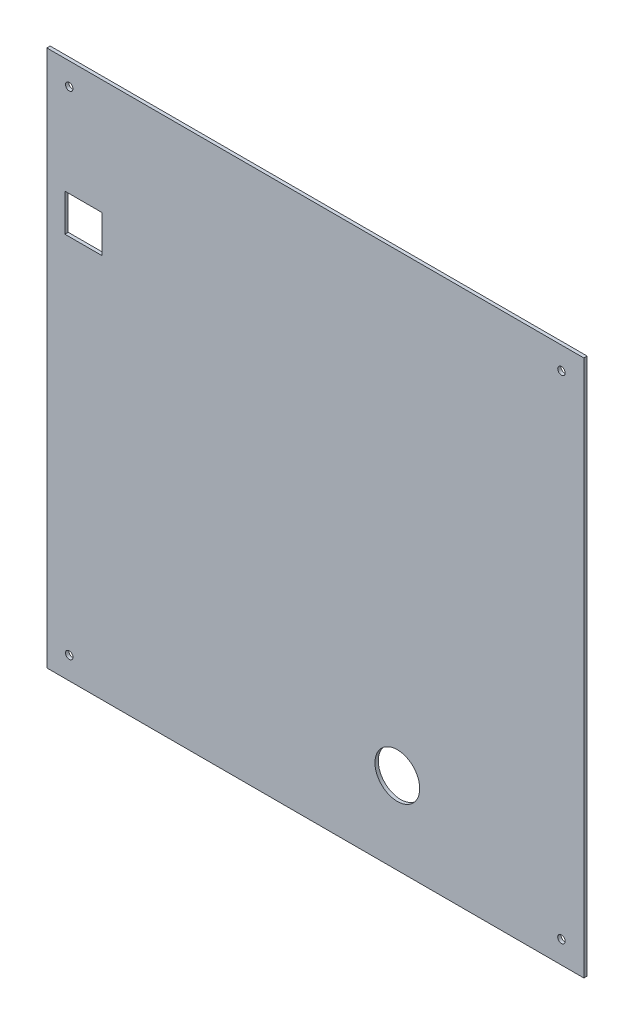
ISO-10303-21;
HEADER;
FILE_DESCRIPTION(('STEP AP214'),'2;1');
FILE_NAME('part.step','',(''),(''),'','','');
FILE_SCHEMA(('AUTOMOTIVE_DESIGN { 1 0 10303 214 1 1 1 1 }'));
ENDSEC;
DATA;
#1=APPLICATION_CONTEXT('core data for automotive mechanical design processes');
#2=APPLICATION_PROTOCOL_DEFINITION('international standard','automotive_design',2000,#1);
#3=PRODUCT_CONTEXT('',#1,'mechanical');
#4=PRODUCT('Part','Part','',(#3));
#5=PRODUCT_RELATED_PRODUCT_CATEGORY('part','',(#4));
#6=PRODUCT_DEFINITION_FORMATION('','',#4);
#7=PRODUCT_DEFINITION_CONTEXT('part definition',#1,'design');
#8=PRODUCT_DEFINITION('design','',#6,#7);
#9=PRODUCT_DEFINITION_SHAPE('','',#8);
#10=(LENGTH_UNIT() NAMED_UNIT(*) SI_UNIT(.MILLI.,.METRE.));
#11=(NAMED_UNIT(*) PLANE_ANGLE_UNIT() SI_UNIT($,.RADIAN.));
#12=(NAMED_UNIT(*) SI_UNIT($,.STERADIAN.) SOLID_ANGLE_UNIT());
#13=UNCERTAINTY_MEASURE_WITH_UNIT(LENGTH_MEASURE(1.E-05),#10,'distance_accuracy_value','');
#14=(GEOMETRIC_REPRESENTATION_CONTEXT(3) GLOBAL_UNCERTAINTY_ASSIGNED_CONTEXT((#13)) GLOBAL_UNIT_ASSIGNED_CONTEXT((#10,
#11,#12)) REPRESENTATION_CONTEXT('',''));
#15=CARTESIAN_POINT('',(0.,0.,0.));
#16=DIRECTION('',(0.,0.,1.));
#17=DIRECTION('',(1.,0.,0.));
#18=AXIS2_PLACEMENT_3D('',#15,#16,#17);
#19=CARTESIAN_POINT('',(-279.4,0.19050000000001,2.8321));
#20=DIRECTION('',(1.,0.,0.));
#21=DIRECTION('',(0.,1.,0.));
#22=AXIS2_PLACEMENT_3D('',#19,#20,#21);
#23=PLANE('',#22);
#24=DIRECTION('',(0.,-1.,0.));
#25=VECTOR('',#24,1.);
#26=CARTESIAN_POINT('',(-279.4,0.19050000000001,0.));
#27=LINE('',#26,#25);
#28=CARTESIAN_POINT('',(-279.4,0.19050000000001,0.));
#29=VERTEX_POINT('',#28);
#30=CARTESIAN_POINT('',(-279.4,-457.0095,0.));
#31=VERTEX_POINT('',#30);
#32=EDGE_CURVE('E140',#29,#31,#27,.T.);
#33=ORIENTED_EDGE('',*,*,#32,.T.);
#34=DIRECTION('',(0.,0.,-1.));
#35=VECTOR('',#34,1.);
#36=CARTESIAN_POINT('',(-279.4,-457.0095,2.8321));
#37=LINE('',#36,#35);
#38=CARTESIAN_POINT('',(-279.4,-457.0095,2.8321));
#39=VERTEX_POINT('',#38);
#40=EDGE_CURVE('E11',#39,#31,#37,.T.);
#41=ORIENTED_EDGE('',*,*,#40,.F.);
#42=DIRECTION('',(0.,-1.,0.));
#43=VECTOR('',#42,1.);
#44=CARTESIAN_POINT('',(-279.4,0.19050000000001,2.8321));
#45=LINE('',#44,#43);
#46=CARTESIAN_POINT('',(-279.4,0.19050000000001,2.8321));
#47=VERTEX_POINT('',#46);
#48=EDGE_CURVE('E145',#47,#39,#45,.T.);
#49=ORIENTED_EDGE('',*,*,#48,.F.);
#50=DIRECTION('',(0.,0.,-1.));
#51=VECTOR('',#50,1.);
#52=CARTESIAN_POINT('',(-279.4,0.19050000000001,2.8321));
#53=LINE('',#52,#51);
#54=EDGE_CURVE('E155',#47,#29,#53,.T.);
#55=ORIENTED_EDGE('',*,*,#54,.T.);
#56=EDGE_LOOP('',(#33,#41,#49,#55));
#57=FACE_BOUND('',#56,.T.);
#58=ADVANCED_FACE('F33',(#57),#23,.F.);
#59=CARTESIAN_POINT('',(-279.4,-457.0095,2.8321));
#60=DIRECTION('',(0.,1.,0.));
#61=DIRECTION('',(0.,0.,1.));
#62=AXIS2_PLACEMENT_3D('',#59,#60,#61);
#63=PLANE('',#62);
#64=DIRECTION('',(1.,0.,0.));
#65=VECTOR('',#64,1.);
#66=CARTESIAN_POINT('',(-279.4,-457.0095,0.));
#67=LINE('',#66,#65);
#68=CARTESIAN_POINT('',(177.8,-457.0095,0.));
#69=VERTEX_POINT('',#68);
#70=EDGE_CURVE('E158',#31,#69,#67,.T.);
#71=ORIENTED_EDGE('',*,*,#70,.T.);
#72=DIRECTION('',(0.,0.,-1.));
#73=VECTOR('',#72,1.);
#74=CARTESIAN_POINT('',(177.8,-457.0095,2.8321));
#75=LINE('',#74,#73);
#76=CARTESIAN_POINT('',(177.8,-457.0095,2.8321));
#77=VERTEX_POINT('',#76);
#78=EDGE_CURVE('E40',#77,#69,#75,.T.);
#79=ORIENTED_EDGE('',*,*,#78,.F.);
#80=DIRECTION('',(1.,0.,0.));
#81=VECTOR('',#80,1.);
#82=CARTESIAN_POINT('',(-279.4,-457.0095,2.8321));
#83=LINE('',#82,#81);
#84=EDGE_CURVE('E148',#39,#77,#83,.T.);
#85=ORIENTED_EDGE('',*,*,#84,.F.);
#86=ORIENTED_EDGE('',*,*,#40,.T.);
#87=EDGE_LOOP('',(#71,#79,#85,#86));
#88=FACE_BOUND('',#87,.T.);
#89=ADVANCED_FACE('F187',(#88),#63,.F.);
#90=CARTESIAN_POINT('',(177.8,0.19050000000001,2.8321));
#91=DIRECTION('',(-1.,0.,0.));
#92=DIRECTION('',(0.,-1.,0.));
#93=AXIS2_PLACEMENT_3D('',#90,#91,#92);
#94=PLANE('',#93);
#95=DIRECTION('',(0.,1.,0.));
#96=VECTOR('',#95,1.);
#97=CARTESIAN_POINT('',(177.8,0.19050000000001,0.));
#98=LINE('',#97,#96);
#99=CARTESIAN_POINT('',(177.8,0.19050000000001,0.));
#100=VERTEX_POINT('',#99);
#101=EDGE_CURVE('E160',#69,#100,#98,.T.);
#102=ORIENTED_EDGE('',*,*,#101,.T.);
#103=DIRECTION('',(0.,0.,-1.));
#104=VECTOR('',#103,1.);
#105=CARTESIAN_POINT('',(177.8,0.19050000000001,2.8321));
#106=LINE('',#105,#104);
#107=CARTESIAN_POINT('',(177.8,0.19050000000001,2.8321));
#108=VERTEX_POINT('',#107);
#109=EDGE_CURVE('E165',#108,#100,#106,.T.);
#110=ORIENTED_EDGE('',*,*,#109,.F.);
#111=DIRECTION('',(0.,1.,0.));
#112=VECTOR('',#111,1.);
#113=CARTESIAN_POINT('',(177.8,0.19050000000001,2.8321));
#114=LINE('',#113,#112);
#115=EDGE_CURVE('E151',#77,#108,#114,.T.);
#116=ORIENTED_EDGE('',*,*,#115,.F.);
#117=ORIENTED_EDGE('',*,*,#78,.T.);
#118=EDGE_LOOP('',(#102,#110,#116,#117));
#119=FACE_BOUND('',#118,.T.);
#120=ADVANCED_FACE('F172',(#119),#94,.F.);
#121=CARTESIAN_POINT('',(-279.4,0.19050000000001,2.8321));
#122=DIRECTION('',(0.,-1.,0.));
#123=DIRECTION('',(0.,0.,-1.));
#124=AXIS2_PLACEMENT_3D('',#121,#122,#123);
#125=PLANE('',#124);
#126=DIRECTION('',(-1.,0.,0.));
#127=VECTOR('',#126,1.);
#128=CARTESIAN_POINT('',(-279.4,0.19050000000001,0.));
#129=LINE('',#128,#127);
#130=EDGE_CURVE('E149',#100,#29,#129,.T.);
#131=ORIENTED_EDGE('',*,*,#130,.T.);
#132=ORIENTED_EDGE('',*,*,#54,.F.);
#133=DIRECTION('',(-1.,0.,0.));
#134=VECTOR('',#133,1.);
#135=CARTESIAN_POINT('',(-279.4,0.19050000000001,2.8321));
#136=LINE('',#135,#134);
#137=EDGE_CURVE('E153',#108,#47,#136,.T.);
#138=ORIENTED_EDGE('',*,*,#137,.F.);
#139=ORIENTED_EDGE('',*,*,#109,.T.);
#140=EDGE_LOOP('',(#131,#132,#138,#139));
#141=FACE_BOUND('',#140,.T.);
#142=ADVANCED_FACE('F180',(#141),#125,.F.);
#143=CARTESIAN_POINT('',(0.,0.,2.8321));
#144=DIRECTION('',(0.,0.,1.));
#145=DIRECTION('',(1.,0.,0.));
#146=AXIS2_PLACEMENT_3D('',#143,#144,#145);
#147=PLANE('',#146);
#148=CARTESIAN_POINT('',(-260.35,-437.9595,2.8321));
#149=DIRECTION('',(0.,0.,1.));
#150=DIRECTION('',(1.,0.,0.));
#151=AXIS2_PLACEMENT_3D('',#148,#149,#150);
#152=CIRCLE('',#151,3.17499999999997);
#153=CARTESIAN_POINT('',(-257.175,-437.9595,2.8321));
#154=VERTEX_POINT('',#153);
#155=EDGE_CURVE('E247',#154,#154,#152,.T.);
#156=ORIENTED_EDGE('',*,*,#155,.F.);
#157=EDGE_LOOP('',(#156));
#158=FACE_BOUND('',#157,.T.);
#159=CARTESIAN_POINT('',(158.75,-437.9595,2.8321));
#160=DIRECTION('',(0.,0.,1.));
#161=DIRECTION('',(1.,0.,0.));
#162=AXIS2_PLACEMENT_3D('',#159,#160,#161);
#163=CIRCLE('',#162,3.17499999999997);
#164=CARTESIAN_POINT('',(161.925,-437.9595,2.8321));
#165=VERTEX_POINT('',#164);
#166=EDGE_CURVE('E253',#165,#165,#163,.T.);
#167=ORIENTED_EDGE('',*,*,#166,.F.);
#168=EDGE_LOOP('',(#167));
#169=FACE_BOUND('',#168,.T.);
#170=CARTESIAN_POINT('',(158.75,-18.8595,2.8321));
#171=DIRECTION('',(0.,0.,1.));
#172=DIRECTION('',(1.,0.,0.));
#173=AXIS2_PLACEMENT_3D('',#170,#171,#172);
#174=CIRCLE('',#173,3.175);
#175=CARTESIAN_POINT('',(161.925,-18.8595,2.8321));
#176=VERTEX_POINT('',#175);
#177=EDGE_CURVE('E121',#176,#176,#174,.T.);
#178=ORIENTED_EDGE('',*,*,#177,.F.);
#179=EDGE_LOOP('',(#178));
#180=FACE_BOUND('',#179,.T.);
#181=DIRECTION('',(0.,1.,0.));
#182=VECTOR('',#181,1.);
#183=CARTESIAN_POINT('',(-232.283,-97.7265,2.8321));
#184=LINE('',#183,#182);
#185=CARTESIAN_POINT('',(-232.283,-129.4765,2.8321));
#186=VERTEX_POINT('',#185);
#187=CARTESIAN_POINT('',(-232.283,-97.7265,2.8321));
#188=VERTEX_POINT('',#187);
#189=EDGE_CURVE('E47',#186,#188,#184,.T.);
#190=ORIENTED_EDGE('',*,*,#189,.F.);
#191=DIRECTION('',(1.,0.,0.));
#192=VECTOR('',#191,1.);
#193=CARTESIAN_POINT('',(-232.283,-129.4765,2.8321));
#194=LINE('',#193,#192);
#195=CARTESIAN_POINT('',(-264.033,-129.4765,2.8321));
#196=VERTEX_POINT('',#195);
#197=EDGE_CURVE('E115',#196,#186,#194,.T.);
#198=ORIENTED_EDGE('',*,*,#197,.F.);
#199=DIRECTION('',(0.,-1.,0.));
#200=VECTOR('',#199,1.);
#201=CARTESIAN_POINT('',(-264.033,-97.7265,2.8321));
#202=LINE('',#201,#200);
#203=CARTESIAN_POINT('',(-264.033,-97.7265,2.8321));
#204=VERTEX_POINT('',#203);
#205=EDGE_CURVE('E118',#204,#196,#202,.T.);
#206=ORIENTED_EDGE('',*,*,#205,.F.);
#207=DIRECTION('',(-1.,0.,0.));
#208=VECTOR('',#207,1.);
#209=CARTESIAN_POINT('',(-232.283,-97.7265,2.8321));
#210=LINE('',#209,#208);
#211=EDGE_CURVE('E127',#188,#204,#210,.T.);
#212=ORIENTED_EDGE('',*,*,#211,.F.);
#213=EDGE_LOOP('',(#190,#198,#206,#212));
#214=FACE_BOUND('',#213,.T.);
#215=CARTESIAN_POINT('',(19.0055500000109,-387.1595,2.8321));
#216=DIRECTION('',(0.,0.,1.));
#217=DIRECTION('',(1.,0.,0.));
#218=AXIS2_PLACEMENT_3D('',#215,#216,#217);
#219=CIRCLE('',#218,19.05);
#220=CARTESIAN_POINT('',(38.0555500000109,-387.1595,2.8321));
#221=VERTEX_POINT('',#220);
#222=EDGE_CURVE('E240',#221,#221,#219,.T.);
#223=ORIENTED_EDGE('',*,*,#222,.F.);
#224=EDGE_LOOP('',(#223));
#225=FACE_BOUND('',#224,.T.);
#226=CARTESIAN_POINT('',(-260.35,-18.8595,2.8321));
#227=DIRECTION('',(0.,0.,1.));
#228=DIRECTION('',(1.,0.,0.));
#229=AXIS2_PLACEMENT_3D('',#226,#227,#228);
#230=CIRCLE('',#229,3.17499999999997);
#231=CARTESIAN_POINT('',(-257.175,-18.8595,2.8321));
#232=VERTEX_POINT('',#231);
#233=EDGE_CURVE('E141',#232,#232,#230,.T.);
#234=ORIENTED_EDGE('',*,*,#233,.F.);
#235=EDGE_LOOP('',(#234));
#236=FACE_BOUND('',#235,.T.);
#237=ORIENTED_EDGE('',*,*,#48,.T.);
#238=ORIENTED_EDGE('',*,*,#84,.T.);
#239=ORIENTED_EDGE('',*,*,#115,.T.);
#240=ORIENTED_EDGE('',*,*,#137,.T.);
#241=EDGE_LOOP('',(#237,#238,#239,#240));
#242=FACE_BOUND('',#241,.T.);
#243=ADVANCED_FACE('F186',(#158,#169,#180,#214,#225,#236,#242),#147,.T.);
#244=CARTESIAN_POINT('',(0.,0.,0.));
#245=DIRECTION('',(0.,0.,1.));
#246=DIRECTION('',(1.,0.,0.));
#247=AXIS2_PLACEMENT_3D('',#244,#245,#246);
#248=PLANE('',#247);
#249=CARTESIAN_POINT('',(-260.35,-437.9595,0.));
#250=DIRECTION('',(0.,0.,1.));
#251=DIRECTION('',(1.,0.,0.));
#252=AXIS2_PLACEMENT_3D('',#249,#250,#251);
#253=CIRCLE('',#252,3.17499999999997);
#254=CARTESIAN_POINT('',(-257.175,-437.9595,0.));
#255=VERTEX_POINT('',#254);
#256=EDGE_CURVE('E144',#255,#255,#253,.T.);
#257=ORIENTED_EDGE('',*,*,#256,.T.);
#258=EDGE_LOOP('',(#257));
#259=FACE_BOUND('',#258,.T.);
#260=CARTESIAN_POINT('',(158.75,-437.9595,0.));
#261=DIRECTION('',(0.,0.,1.));
#262=DIRECTION('',(1.,0.,0.));
#263=AXIS2_PLACEMENT_3D('',#260,#261,#262);
#264=CIRCLE('',#263,3.17499999999997);
#265=CARTESIAN_POINT('',(161.925,-437.9595,0.));
#266=VERTEX_POINT('',#265);
#267=EDGE_CURVE('E250',#266,#266,#264,.T.);
#268=ORIENTED_EDGE('',*,*,#267,.T.);
#269=EDGE_LOOP('',(#268));
#270=FACE_BOUND('',#269,.T.);
#271=CARTESIAN_POINT('',(158.75,-18.8595,0.));
#272=DIRECTION('',(0.,0.,1.));
#273=DIRECTION('',(1.,0.,0.));
#274=AXIS2_PLACEMENT_3D('',#271,#272,#273);
#275=CIRCLE('',#274,3.175);
#276=CARTESIAN_POINT('',(161.925,-18.8595,0.));
#277=VERTEX_POINT('',#276);
#278=EDGE_CURVE('E255',#277,#277,#275,.T.);
#279=ORIENTED_EDGE('',*,*,#278,.T.);
#280=EDGE_LOOP('',(#279));
#281=FACE_BOUND('',#280,.T.);
#282=DIRECTION('',(1.,0.,0.));
#283=VECTOR('',#282,1.);
#284=CARTESIAN_POINT('',(-232.283,-129.4765,0.));
#285=LINE('',#284,#283);
#286=CARTESIAN_POINT('',(-264.033,-129.4765,0.));
#287=VERTEX_POINT('',#286);
#288=CARTESIAN_POINT('',(-232.283,-129.4765,0.));
#289=VERTEX_POINT('',#288);
#290=EDGE_CURVE('E105',#287,#289,#285,.T.);
#291=ORIENTED_EDGE('',*,*,#290,.T.);
#292=DIRECTION('',(0.,1.,0.));
#293=VECTOR('',#292,1.);
#294=CARTESIAN_POINT('',(-232.283,-97.7265,0.));
#295=LINE('',#294,#293);
#296=CARTESIAN_POINT('',(-232.283,-97.7265,0.));
#297=VERTEX_POINT('',#296);
#298=EDGE_CURVE('E99',#289,#297,#295,.T.);
#299=ORIENTED_EDGE('',*,*,#298,.T.);
#300=DIRECTION('',(-1.,0.,0.));
#301=VECTOR('',#300,1.);
#302=CARTESIAN_POINT('',(-232.283,-97.7265,0.));
#303=LINE('',#302,#301);
#304=CARTESIAN_POINT('',(-264.033,-97.7265,0.));
#305=VERTEX_POINT('',#304);
#306=EDGE_CURVE('E108',#297,#305,#303,.T.);
#307=ORIENTED_EDGE('',*,*,#306,.T.);
#308=DIRECTION('',(0.,-1.,0.));
#309=VECTOR('',#308,1.);
#310=CARTESIAN_POINT('',(-264.033,-97.7265,0.));
#311=LINE('',#310,#309);
#312=EDGE_CURVE('E55',#305,#287,#311,.T.);
#313=ORIENTED_EDGE('',*,*,#312,.T.);
#314=EDGE_LOOP('',(#291,#299,#307,#313));
#315=FACE_BOUND('',#314,.T.);
#316=CARTESIAN_POINT('',(19.0055500000109,-387.1595,0.));
#317=DIRECTION('',(0.,0.,1.));
#318=DIRECTION('',(1.,0.,0.));
#319=AXIS2_PLACEMENT_3D('',#316,#317,#318);
#320=CIRCLE('',#319,19.05);
#321=CARTESIAN_POINT('',(38.0555500000109,-387.1595,0.));
#322=VERTEX_POINT('',#321);
#323=EDGE_CURVE('E128',#322,#322,#320,.T.);
#324=ORIENTED_EDGE('',*,*,#323,.T.);
#325=EDGE_LOOP('',(#324));
#326=FACE_BOUND('',#325,.T.);
#327=CARTESIAN_POINT('',(-260.35,-18.8595,0.));
#328=DIRECTION('',(0.,0.,1.));
#329=DIRECTION('',(1.,0.,0.));
#330=AXIS2_PLACEMENT_3D('',#327,#328,#329);
#331=CIRCLE('',#330,3.17499999999997);
#332=CARTESIAN_POINT('',(-257.175,-18.8595,0.));
#333=VERTEX_POINT('',#332);
#334=EDGE_CURVE('E137',#333,#333,#331,.T.);
#335=ORIENTED_EDGE('',*,*,#334,.T.);
#336=EDGE_LOOP('',(#335));
#337=FACE_BOUND('',#336,.T.);
#338=ORIENTED_EDGE('',*,*,#32,.F.);
#339=ORIENTED_EDGE('',*,*,#130,.F.);
#340=ORIENTED_EDGE('',*,*,#101,.F.);
#341=ORIENTED_EDGE('',*,*,#70,.F.);
#342=EDGE_LOOP('',(#338,#339,#340,#341));
#343=FACE_BOUND('',#342,.T.);
#344=ADVANCED_FACE('F112',(#259,#270,#281,#315,#326,#337,#343),#248,.F.);
#345=CARTESIAN_POINT('',(-260.35,-18.8595,0.));
#346=DIRECTION('',(0.,0.,1.));
#347=DIRECTION('',(1.,0.,0.));
#348=AXIS2_PLACEMENT_3D('',#345,#346,#347);
#349=CYLINDRICAL_SURFACE('',#348,3.17499999999997);
#350=CARTESIAN_POINT('',(-257.175,-18.8595,0.));
#351=CARTESIAN_POINT('',(-257.175,-18.8595,0.0295010416666667));
#352=CARTESIAN_POINT('',(-257.175,-18.8595,0.0590020833333333));
#353=CARTESIAN_POINT('',(-257.175,-18.8595,0.118004166666667));
#354=CARTESIAN_POINT('',(-257.175,-18.8595,0.147505208333333));
#355=CARTESIAN_POINT('',(-257.175,-18.8595,0.206507291666667));
#356=CARTESIAN_POINT('',(-257.175,-18.8595,0.236008333333333));
#357=CARTESIAN_POINT('',(-257.175,-18.8595,0.295010416666667));
#358=CARTESIAN_POINT('',(-257.175,-18.8595,0.324511458333333));
#359=CARTESIAN_POINT('',(-257.175,-18.8595,0.383513541666667));
#360=CARTESIAN_POINT('',(-257.175,-18.8595,0.413014583333333));
#361=CARTESIAN_POINT('',(-257.175,-18.8595,0.472016666666667));
#362=CARTESIAN_POINT('',(-257.175,-18.8595,0.501517708333333));
#363=CARTESIAN_POINT('',(-257.175,-18.8595,0.560519791666667));
#364=CARTESIAN_POINT('',(-257.175,-18.8595,0.590020833333333));
#365=CARTESIAN_POINT('',(-257.175,-18.8595,0.649022916666667));
#366=CARTESIAN_POINT('',(-257.175,-18.8595,0.678523958333333));
#367=CARTESIAN_POINT('',(-257.175,-18.8595,0.737526041666667));
#368=CARTESIAN_POINT('',(-257.175,-18.8595,0.767027083333333));
#369=CARTESIAN_POINT('',(-257.175,-18.8595,0.826029166666667));
#370=CARTESIAN_POINT('',(-257.175,-18.8595,0.855530208333333));
#371=CARTESIAN_POINT('',(-257.175,-18.8595,0.914532291666667));
#372=CARTESIAN_POINT('',(-257.175,-18.8595,0.944033333333333));
#373=CARTESIAN_POINT('',(-257.175,-18.8595,1.00303541666667));
#374=CARTESIAN_POINT('',(-257.175,-18.8595,1.03253645833333));
#375=CARTESIAN_POINT('',(-257.175,-18.8595,1.09153854166667));
#376=CARTESIAN_POINT('',(-257.175,-18.8595,1.12103958333333));
#377=CARTESIAN_POINT('',(-257.175,-18.8595,1.18004166666667));
#378=CARTESIAN_POINT('',(-257.175,-18.8595,1.20954270833333));
#379=CARTESIAN_POINT('',(-257.175,-18.8595,1.26854479166667));
#380=CARTESIAN_POINT('',(-257.175,-18.8595,1.29804583333333));
#381=CARTESIAN_POINT('',(-257.175,-18.8595,1.35704791666667));
#382=CARTESIAN_POINT('',(-257.175,-18.8595,1.38654895833333));
#383=CARTESIAN_POINT('',(-257.175,-18.8595,1.44555104166667));
#384=CARTESIAN_POINT('',(-257.175,-18.8595,1.47505208333333));
#385=CARTESIAN_POINT('',(-257.175,-18.8595,1.53405416666667));
#386=CARTESIAN_POINT('',(-257.175,-18.8595,1.56355520833333));
#387=CARTESIAN_POINT('',(-257.175,-18.8595,1.62255729166667));
#388=CARTESIAN_POINT('',(-257.175,-18.8595,1.65205833333333));
#389=CARTESIAN_POINT('',(-257.175,-18.8595,1.71106041666667));
#390=CARTESIAN_POINT('',(-257.175,-18.8595,1.74056145833333));
#391=CARTESIAN_POINT('',(-257.175,-18.8595,1.79956354166667));
#392=CARTESIAN_POINT('',(-257.175,-18.8595,1.82906458333333));
#393=CARTESIAN_POINT('',(-257.175,-18.8595,1.88806666666667));
#394=CARTESIAN_POINT('',(-257.175,-18.8595,1.91756770833333));
#395=CARTESIAN_POINT('',(-257.175,-18.8595,1.97656979166667));
#396=CARTESIAN_POINT('',(-257.175,-18.8595,2.00607083333333));
#397=CARTESIAN_POINT('',(-257.175,-18.8595,2.06507291666667));
#398=CARTESIAN_POINT('',(-257.175,-18.8595,2.09457395833333));
#399=CARTESIAN_POINT('',(-257.175,-18.8595,2.15357604166667));
#400=CARTESIAN_POINT('',(-257.175,-18.8595,2.18307708333333));
#401=CARTESIAN_POINT('',(-257.175,-18.8595,2.24207916666667));
#402=CARTESIAN_POINT('',(-257.175,-18.8595,2.27158020833333));
#403=CARTESIAN_POINT('',(-257.175,-18.8595,2.33058229166667));
#404=CARTESIAN_POINT('',(-257.175,-18.8595,2.36008333333333));
#405=CARTESIAN_POINT('',(-257.175,-18.8595,2.41908541666667));
#406=CARTESIAN_POINT('',(-257.175,-18.8595,2.44858645833333));
#407=CARTESIAN_POINT('',(-257.175,-18.8595,2.50758854166667));
#408=CARTESIAN_POINT('',(-257.175,-18.8595,2.53708958333333));
#409=CARTESIAN_POINT('',(-257.175,-18.8595,2.59609166666667));
#410=CARTESIAN_POINT('',(-257.175,-18.8595,2.62559270833333));
#411=CARTESIAN_POINT('',(-257.175,-18.8595,2.68459479166667));
#412=CARTESIAN_POINT('',(-257.175,-18.8595,2.71409583333333));
#413=CARTESIAN_POINT('',(-257.175,-18.8595,2.77309791666667));
#414=CARTESIAN_POINT('',(-257.175,-18.8595,2.80259895833333));
#415=CARTESIAN_POINT('',(-257.175,-18.8595,2.8321));
#416=B_SPLINE_CURVE_WITH_KNOTS('',3,(#350,#351,#352,#353,#354,#355,#356,#357,#358,#359,#360,
#361,#362,#363,#364,#365,#366,#367,#368,#369,#370,#371,#372,#373,#374,#375,#376,#377,#378,#379,
#380,#381,#382,#383,#384,#385,#386,#387,#388,#389,#390,#391,#392,#393,#394,#395,#396,#397,#398,
#399,#400,#401,#402,#403,#404,#405,#406,#407,#408,#409,#410,#411,#412,#413,#414,#415),
.UNSPECIFIED.,.F.,.F.,(4,2,2,2,2,2,2,2,2,2,2,2,2,2,2,2,2,2,2,2,2,2,2,2,2,2,2,2,2,2,2,2,4),(0.,
0.088503125,0.17700625,0.265509375,0.3540125,0.442515625,0.53101875,0.619521875,0.708025,
0.796528125,0.88503125,0.973534375,1.0620375,1.150540625,1.23904375,1.327546875,1.41605,
1.504553125,1.59305625,1.681559375,1.7700625,1.858565625,1.94706875,2.035571875,2.124075,
2.212578125,2.30108125,2.389584375,2.4780875,2.566590625,2.65509375,2.743596875,2.8321),.UNSPECIFIED.);
#417=EDGE_CURVE('BSEAM199',#333,#232,#416,.T.);
#418=ORIENTED_EDGE('',*,*,#334,.F.);
#419=ORIENTED_EDGE('',*,*,#233,.T.);
#420=ORIENTED_EDGE('',*,*,#417,.T.);
#421=ORIENTED_EDGE('',*,*,#417,.F.);
#422=EDGE_LOOP('',(#418,#420,#419,#421));
#423=FACE_BOUND('',#422,.T.);
#424=ADVANCED_FACE('F199',(#423),#349,.F.);
#425=CARTESIAN_POINT('',(19.0055500000109,-387.1595,0.));
#426=DIRECTION('',(0.,0.,1.));
#427=DIRECTION('',(1.,0.,0.));
#428=AXIS2_PLACEMENT_3D('',#425,#426,#427);
#429=CYLINDRICAL_SURFACE('',#428,19.05);
#430=CARTESIAN_POINT('',(38.0555500000109,-387.1595,0.));
#431=CARTESIAN_POINT('',(38.0555500000109,-387.1595,0.0295010416666667));
#432=CARTESIAN_POINT('',(38.0555500000109,-387.1595,0.0590020833333333));
#433=CARTESIAN_POINT('',(38.0555500000109,-387.1595,0.118004166666667));
#434=CARTESIAN_POINT('',(38.0555500000109,-387.1595,0.147505208333333));
#435=CARTESIAN_POINT('',(38.0555500000109,-387.1595,0.206507291666667));
#436=CARTESIAN_POINT('',(38.0555500000109,-387.1595,0.236008333333333));
#437=CARTESIAN_POINT('',(38.0555500000109,-387.1595,0.295010416666667));
#438=CARTESIAN_POINT('',(38.0555500000109,-387.1595,0.324511458333333));
#439=CARTESIAN_POINT('',(38.0555500000109,-387.1595,0.383513541666667));
#440=CARTESIAN_POINT('',(38.0555500000109,-387.1595,0.413014583333333));
#441=CARTESIAN_POINT('',(38.0555500000109,-387.1595,0.472016666666667));
#442=CARTESIAN_POINT('',(38.0555500000109,-387.1595,0.501517708333333));
#443=CARTESIAN_POINT('',(38.0555500000109,-387.1595,0.560519791666667));
#444=CARTESIAN_POINT('',(38.0555500000109,-387.1595,0.590020833333333));
#445=CARTESIAN_POINT('',(38.0555500000109,-387.1595,0.649022916666667));
#446=CARTESIAN_POINT('',(38.0555500000109,-387.1595,0.678523958333333));
#447=CARTESIAN_POINT('',(38.0555500000109,-387.1595,0.737526041666667));
#448=CARTESIAN_POINT('',(38.0555500000109,-387.1595,0.767027083333333));
#449=CARTESIAN_POINT('',(38.0555500000109,-387.1595,0.826029166666667));
#450=CARTESIAN_POINT('',(38.0555500000109,-387.1595,0.855530208333333));
#451=CARTESIAN_POINT('',(38.0555500000109,-387.1595,0.914532291666667));
#452=CARTESIAN_POINT('',(38.0555500000109,-387.1595,0.944033333333333));
#453=CARTESIAN_POINT('',(38.0555500000109,-387.1595,1.00303541666667));
#454=CARTESIAN_POINT('',(38.0555500000109,-387.1595,1.03253645833333));
#455=CARTESIAN_POINT('',(38.0555500000109,-387.1595,1.09153854166667));
#456=CARTESIAN_POINT('',(38.0555500000109,-387.1595,1.12103958333333));
#457=CARTESIAN_POINT('',(38.0555500000109,-387.1595,1.18004166666667));
#458=CARTESIAN_POINT('',(38.0555500000109,-387.1595,1.20954270833333));
#459=CARTESIAN_POINT('',(38.0555500000109,-387.1595,1.26854479166667));
#460=CARTESIAN_POINT('',(38.0555500000109,-387.1595,1.29804583333333));
#461=CARTESIAN_POINT('',(38.0555500000109,-387.1595,1.35704791666667));
#462=CARTESIAN_POINT('',(38.0555500000109,-387.1595,1.38654895833333));
#463=CARTESIAN_POINT('',(38.0555500000109,-387.1595,1.44555104166667));
#464=CARTESIAN_POINT('',(38.0555500000109,-387.1595,1.47505208333333));
#465=CARTESIAN_POINT('',(38.0555500000109,-387.1595,1.53405416666667));
#466=CARTESIAN_POINT('',(38.0555500000109,-387.1595,1.56355520833333));
#467=CARTESIAN_POINT('',(38.0555500000109,-387.1595,1.62255729166667));
#468=CARTESIAN_POINT('',(38.0555500000109,-387.1595,1.65205833333333));
#469=CARTESIAN_POINT('',(38.0555500000109,-387.1595,1.71106041666667));
#470=CARTESIAN_POINT('',(38.0555500000109,-387.1595,1.74056145833333));
#471=CARTESIAN_POINT('',(38.0555500000109,-387.1595,1.79956354166667));
#472=CARTESIAN_POINT('',(38.0555500000109,-387.1595,1.82906458333333));
#473=CARTESIAN_POINT('',(38.0555500000109,-387.1595,1.88806666666667));
#474=CARTESIAN_POINT('',(38.0555500000109,-387.1595,1.91756770833333));
#475=CARTESIAN_POINT('',(38.0555500000109,-387.1595,1.97656979166667));
#476=CARTESIAN_POINT('',(38.0555500000109,-387.1595,2.00607083333333));
#477=CARTESIAN_POINT('',(38.0555500000109,-387.1595,2.06507291666667));
#478=CARTESIAN_POINT('',(38.0555500000109,-387.1595,2.09457395833333));
#479=CARTESIAN_POINT('',(38.0555500000109,-387.1595,2.15357604166667));
#480=CARTESIAN_POINT('',(38.0555500000109,-387.1595,2.18307708333333));
#481=CARTESIAN_POINT('',(38.0555500000109,-387.1595,2.24207916666667));
#482=CARTESIAN_POINT('',(38.0555500000109,-387.1595,2.27158020833333));
#483=CARTESIAN_POINT('',(38.0555500000109,-387.1595,2.33058229166667));
#484=CARTESIAN_POINT('',(38.0555500000109,-387.1595,2.36008333333333));
#485=CARTESIAN_POINT('',(38.0555500000109,-387.1595,2.41908541666667));
#486=CARTESIAN_POINT('',(38.0555500000109,-387.1595,2.44858645833333));
#487=CARTESIAN_POINT('',(38.0555500000109,-387.1595,2.50758854166667));
#488=CARTESIAN_POINT('',(38.0555500000109,-387.1595,2.53708958333333));
#489=CARTESIAN_POINT('',(38.0555500000109,-387.1595,2.59609166666667));
#490=CARTESIAN_POINT('',(38.0555500000109,-387.1595,2.62559270833333));
#491=CARTESIAN_POINT('',(38.0555500000109,-387.1595,2.68459479166667));
#492=CARTESIAN_POINT('',(38.0555500000109,-387.1595,2.71409583333333));
#493=CARTESIAN_POINT('',(38.0555500000109,-387.1595,2.77309791666667));
#494=CARTESIAN_POINT('',(38.0555500000109,-387.1595,2.80259895833333));
#495=CARTESIAN_POINT('',(38.0555500000109,-387.1595,2.8321));
#496=B_SPLINE_CURVE_WITH_KNOTS('',3,(#430,#431,#432,#433,#434,#435,#436,#437,#438,#439,#440,
#441,#442,#443,#444,#445,#446,#447,#448,#449,#450,#451,#452,#453,#454,#455,#456,#457,#458,#459,
#460,#461,#462,#463,#464,#465,#466,#467,#468,#469,#470,#471,#472,#473,#474,#475,#476,#477,#478,
#479,#480,#481,#482,#483,#484,#485,#486,#487,#488,#489,#490,#491,#492,#493,#494,#495),
.UNSPECIFIED.,.F.,.F.,(4,2,2,2,2,2,2,2,2,2,2,2,2,2,2,2,2,2,2,2,2,2,2,2,2,2,2,2,2,2,2,2,4),(0.,
0.088503125,0.17700625,0.265509375,0.3540125,0.442515625,0.53101875,0.619521875,0.708025,
0.796528125,0.88503125,0.973534375,1.0620375,1.150540625,1.23904375,1.327546875,1.41605,
1.504553125,1.59305625,1.681559375,1.7700625,1.858565625,1.94706875,2.035571875,2.124075,
2.212578125,2.30108125,2.389584375,2.4780875,2.566590625,2.65509375,2.743596875,2.8321),.UNSPECIFIED.);
#497=EDGE_CURVE('BSEAM206',#322,#221,#496,.T.);
#498=ORIENTED_EDGE('',*,*,#323,.F.);
#499=ORIENTED_EDGE('',*,*,#222,.T.);
#500=ORIENTED_EDGE('',*,*,#497,.T.);
#501=ORIENTED_EDGE('',*,*,#497,.F.);
#502=EDGE_LOOP('',(#498,#500,#499,#501));
#503=FACE_BOUND('',#502,.T.);
#504=ADVANCED_FACE('F206',(#503),#429,.F.);
#505=CARTESIAN_POINT('',(-232.283,-97.7265,0.));
#506=DIRECTION('',(1.,0.,0.));
#507=DIRECTION('',(0.,0.,-1.));
#508=AXIS2_PLACEMENT_3D('',#505,#506,#507);
#509=PLANE('',#508);
#510=ORIENTED_EDGE('',*,*,#189,.T.);
#511=DIRECTION('',(0.,0.,1.));
#512=VECTOR('',#511,1.);
#513=CARTESIAN_POINT('',(-232.283,-97.7265,0.));
#514=LINE('',#513,#512);
#515=EDGE_CURVE('E95',#297,#188,#514,.T.);
#516=ORIENTED_EDGE('',*,*,#515,.F.);
#517=ORIENTED_EDGE('',*,*,#298,.F.);
#518=DIRECTION('',(0.,0.,1.));
#519=VECTOR('',#518,1.);
#520=CARTESIAN_POINT('',(-232.283,-129.4765,0.));
#521=LINE('',#520,#519);
#522=EDGE_CURVE('E132',#289,#186,#521,.T.);
#523=ORIENTED_EDGE('',*,*,#522,.T.);
#524=EDGE_LOOP('',(#510,#516,#517,#523));
#525=FACE_BOUND('',#524,.T.);
#526=ADVANCED_FACE('F97',(#525),#509,.F.);
#527=CARTESIAN_POINT('',(-232.283,-129.4765,0.));
#528=DIRECTION('',(0.,-1.,0.));
#529=DIRECTION('',(0.,0.,-1.));
#530=AXIS2_PLACEMENT_3D('',#527,#528,#529);
#531=PLANE('',#530);
#532=ORIENTED_EDGE('',*,*,#197,.T.);
#533=ORIENTED_EDGE('',*,*,#522,.F.);
#534=ORIENTED_EDGE('',*,*,#290,.F.);
#535=DIRECTION('',(0.,0.,1.));
#536=VECTOR('',#535,1.);
#537=CARTESIAN_POINT('',(-264.033,-129.4765,0.));
#538=LINE('',#537,#536);
#539=EDGE_CURVE('E134',#287,#196,#538,.T.);
#540=ORIENTED_EDGE('',*,*,#539,.T.);
#541=EDGE_LOOP('',(#532,#533,#534,#540));
#542=FACE_BOUND('',#541,.T.);
#543=ADVANCED_FACE('F210',(#542),#531,.F.);
#544=CARTESIAN_POINT('',(-264.033,-97.7265,0.));
#545=DIRECTION('',(-1.,0.,0.));
#546=DIRECTION('',(0.,0.,1.));
#547=AXIS2_PLACEMENT_3D('',#544,#545,#546);
#548=PLANE('',#547);
#549=ORIENTED_EDGE('',*,*,#205,.T.);
#550=ORIENTED_EDGE('',*,*,#539,.F.);
#551=ORIENTED_EDGE('',*,*,#312,.F.);
#552=DIRECTION('',(0.,0.,1.));
#553=VECTOR('',#552,1.);
#554=CARTESIAN_POINT('',(-264.033,-97.7265,0.));
#555=LINE('',#554,#553);
#556=EDGE_CURVE('E104',#305,#204,#555,.T.);
#557=ORIENTED_EDGE('',*,*,#556,.T.);
#558=EDGE_LOOP('',(#549,#550,#551,#557));
#559=FACE_BOUND('',#558,.T.);
#560=ADVANCED_FACE('F214',(#559),#548,.F.);
#561=CARTESIAN_POINT('',(-232.283,-97.7265,0.));
#562=DIRECTION('',(0.,1.,0.));
#563=DIRECTION('',(0.,0.,1.));
#564=AXIS2_PLACEMENT_3D('',#561,#562,#563);
#565=PLANE('',#564);
#566=ORIENTED_EDGE('',*,*,#211,.T.);
#567=ORIENTED_EDGE('',*,*,#556,.F.);
#568=ORIENTED_EDGE('',*,*,#306,.F.);
#569=ORIENTED_EDGE('',*,*,#515,.T.);
#570=EDGE_LOOP('',(#566,#567,#568,#569));
#571=FACE_BOUND('',#570,.T.);
#572=ADVANCED_FACE('F109',(#571),#565,.F.);
#573=CARTESIAN_POINT('',(158.75,-18.8595,0.));
#574=DIRECTION('',(0.,0.,1.));
#575=DIRECTION('',(1.,0.,0.));
#576=AXIS2_PLACEMENT_3D('',#573,#574,#575);
#577=CYLINDRICAL_SURFACE('',#576,3.175);
#578=CARTESIAN_POINT('',(161.925,-18.8595,0.));
#579=CARTESIAN_POINT('',(161.925,-18.8595,0.0295010416666667));
#580=CARTESIAN_POINT('',(161.925,-18.8595,0.0590020833333333));
#581=CARTESIAN_POINT('',(161.925,-18.8595,0.118004166666667));
#582=CARTESIAN_POINT('',(161.925,-18.8595,0.147505208333333));
#583=CARTESIAN_POINT('',(161.925,-18.8595,0.206507291666667));
#584=CARTESIAN_POINT('',(161.925,-18.8595,0.236008333333333));
#585=CARTESIAN_POINT('',(161.925,-18.8595,0.295010416666667));
#586=CARTESIAN_POINT('',(161.925,-18.8595,0.324511458333333));
#587=CARTESIAN_POINT('',(161.925,-18.8595,0.383513541666667));
#588=CARTESIAN_POINT('',(161.925,-18.8595,0.413014583333333));
#589=CARTESIAN_POINT('',(161.925,-18.8595,0.472016666666667));
#590=CARTESIAN_POINT('',(161.925,-18.8595,0.501517708333333));
#591=CARTESIAN_POINT('',(161.925,-18.8595,0.560519791666667));
#592=CARTESIAN_POINT('',(161.925,-18.8595,0.590020833333333));
#593=CARTESIAN_POINT('',(161.925,-18.8595,0.649022916666667));
#594=CARTESIAN_POINT('',(161.925,-18.8595,0.678523958333333));
#595=CARTESIAN_POINT('',(161.925,-18.8595,0.737526041666667));
#596=CARTESIAN_POINT('',(161.925,-18.8595,0.767027083333333));
#597=CARTESIAN_POINT('',(161.925,-18.8595,0.826029166666667));
#598=CARTESIAN_POINT('',(161.925,-18.8595,0.855530208333333));
#599=CARTESIAN_POINT('',(161.925,-18.8595,0.914532291666667));
#600=CARTESIAN_POINT('',(161.925,-18.8595,0.944033333333333));
#601=CARTESIAN_POINT('',(161.925,-18.8595,1.00303541666667));
#602=CARTESIAN_POINT('',(161.925,-18.8595,1.03253645833333));
#603=CARTESIAN_POINT('',(161.925,-18.8595,1.09153854166667));
#604=CARTESIAN_POINT('',(161.925,-18.8595,1.12103958333333));
#605=CARTESIAN_POINT('',(161.925,-18.8595,1.18004166666667));
#606=CARTESIAN_POINT('',(161.925,-18.8595,1.20954270833333));
#607=CARTESIAN_POINT('',(161.925,-18.8595,1.26854479166667));
#608=CARTESIAN_POINT('',(161.925,-18.8595,1.29804583333333));
#609=CARTESIAN_POINT('',(161.925,-18.8595,1.35704791666667));
#610=CARTESIAN_POINT('',(161.925,-18.8595,1.38654895833333));
#611=CARTESIAN_POINT('',(161.925,-18.8595,1.44555104166667));
#612=CARTESIAN_POINT('',(161.925,-18.8595,1.47505208333333));
#613=CARTESIAN_POINT('',(161.925,-18.8595,1.53405416666667));
#614=CARTESIAN_POINT('',(161.925,-18.8595,1.56355520833333));
#615=CARTESIAN_POINT('',(161.925,-18.8595,1.62255729166667));
#616=CARTESIAN_POINT('',(161.925,-18.8595,1.65205833333333));
#617=CARTESIAN_POINT('',(161.925,-18.8595,1.71106041666667));
#618=CARTESIAN_POINT('',(161.925,-18.8595,1.74056145833333));
#619=CARTESIAN_POINT('',(161.925,-18.8595,1.79956354166667));
#620=CARTESIAN_POINT('',(161.925,-18.8595,1.82906458333333));
#621=CARTESIAN_POINT('',(161.925,-18.8595,1.88806666666667));
#622=CARTESIAN_POINT('',(161.925,-18.8595,1.91756770833333));
#623=CARTESIAN_POINT('',(161.925,-18.8595,1.97656979166667));
#624=CARTESIAN_POINT('',(161.925,-18.8595,2.00607083333333));
#625=CARTESIAN_POINT('',(161.925,-18.8595,2.06507291666667));
#626=CARTESIAN_POINT('',(161.925,-18.8595,2.09457395833333));
#627=CARTESIAN_POINT('',(161.925,-18.8595,2.15357604166667));
#628=CARTESIAN_POINT('',(161.925,-18.8595,2.18307708333333));
#629=CARTESIAN_POINT('',(161.925,-18.8595,2.24207916666667));
#630=CARTESIAN_POINT('',(161.925,-18.8595,2.27158020833333));
#631=CARTESIAN_POINT('',(161.925,-18.8595,2.33058229166667));
#632=CARTESIAN_POINT('',(161.925,-18.8595,2.36008333333333));
#633=CARTESIAN_POINT('',(161.925,-18.8595,2.41908541666667));
#634=CARTESIAN_POINT('',(161.925,-18.8595,2.44858645833333));
#635=CARTESIAN_POINT('',(161.925,-18.8595,2.50758854166667));
#636=CARTESIAN_POINT('',(161.925,-18.8595,2.53708958333333));
#637=CARTESIAN_POINT('',(161.925,-18.8595,2.59609166666667));
#638=CARTESIAN_POINT('',(161.925,-18.8595,2.62559270833333));
#639=CARTESIAN_POINT('',(161.925,-18.8595,2.68459479166667));
#640=CARTESIAN_POINT('',(161.925,-18.8595,2.71409583333333));
#641=CARTESIAN_POINT('',(161.925,-18.8595,2.77309791666667));
#642=CARTESIAN_POINT('',(161.925,-18.8595,2.80259895833333));
#643=CARTESIAN_POINT('',(161.925,-18.8595,2.8321));
#644=B_SPLINE_CURVE_WITH_KNOTS('',3,(#578,#579,#580,#581,#582,#583,#584,#585,#586,#587,#588,
#589,#590,#591,#592,#593,#594,#595,#596,#597,#598,#599,#600,#601,#602,#603,#604,#605,#606,#607,
#608,#609,#610,#611,#612,#613,#614,#615,#616,#617,#618,#619,#620,#621,#622,#623,#624,#625,#626,
#627,#628,#629,#630,#631,#632,#633,#634,#635,#636,#637,#638,#639,#640,#641,#642,#643),
.UNSPECIFIED.,.F.,.F.,(4,2,2,2,2,2,2,2,2,2,2,2,2,2,2,2,2,2,2,2,2,2,2,2,2,2,2,2,2,2,2,2,4),(0.,
0.088503125,0.17700625,0.265509375,0.3540125,0.442515625,0.53101875,0.619521875,0.708025,
0.796528125,0.88503125,0.973534375,1.0620375,1.150540625,1.23904375,1.327546875,1.41605,
1.504553125,1.59305625,1.681559375,1.7700625,1.858565625,1.94706875,2.035571875,2.124075,
2.212578125,2.30108125,2.389584375,2.4780875,2.566590625,2.65509375,2.743596875,2.8321),.UNSPECIFIED.);
#645=EDGE_CURVE('BSEAM213',#277,#176,#644,.T.);
#646=ORIENTED_EDGE('',*,*,#278,.F.);
#647=ORIENTED_EDGE('',*,*,#177,.T.);
#648=ORIENTED_EDGE('',*,*,#645,.T.);
#649=ORIENTED_EDGE('',*,*,#645,.F.);
#650=EDGE_LOOP('',(#646,#648,#647,#649));
#651=FACE_BOUND('',#650,.T.);
#652=ADVANCED_FACE('F213',(#651),#577,.F.);
#653=CARTESIAN_POINT('',(158.75,-437.9595,0.));
#654=DIRECTION('',(0.,0.,1.));
#655=DIRECTION('',(1.,0.,0.));
#656=AXIS2_PLACEMENT_3D('',#653,#654,#655);
#657=CYLINDRICAL_SURFACE('',#656,3.17499999999997);
#658=CARTESIAN_POINT('',(161.925,-437.9595,0.));
#659=CARTESIAN_POINT('',(161.925,-437.9595,0.0295010416666667));
#660=CARTESIAN_POINT('',(161.925,-437.9595,0.0590020833333333));
#661=CARTESIAN_POINT('',(161.925,-437.9595,0.118004166666667));
#662=CARTESIAN_POINT('',(161.925,-437.9595,0.147505208333333));
#663=CARTESIAN_POINT('',(161.925,-437.9595,0.206507291666667));
#664=CARTESIAN_POINT('',(161.925,-437.9595,0.236008333333333));
#665=CARTESIAN_POINT('',(161.925,-437.9595,0.295010416666667));
#666=CARTESIAN_POINT('',(161.925,-437.9595,0.324511458333333));
#667=CARTESIAN_POINT('',(161.925,-437.9595,0.383513541666667));
#668=CARTESIAN_POINT('',(161.925,-437.9595,0.413014583333333));
#669=CARTESIAN_POINT('',(161.925,-437.9595,0.472016666666667));
#670=CARTESIAN_POINT('',(161.925,-437.9595,0.501517708333333));
#671=CARTESIAN_POINT('',(161.925,-437.9595,0.560519791666667));
#672=CARTESIAN_POINT('',(161.925,-437.9595,0.590020833333333));
#673=CARTESIAN_POINT('',(161.925,-437.9595,0.649022916666667));
#674=CARTESIAN_POINT('',(161.925,-437.9595,0.678523958333333));
#675=CARTESIAN_POINT('',(161.925,-437.9595,0.737526041666667));
#676=CARTESIAN_POINT('',(161.925,-437.9595,0.767027083333333));
#677=CARTESIAN_POINT('',(161.925,-437.9595,0.826029166666667));
#678=CARTESIAN_POINT('',(161.925,-437.9595,0.855530208333333));
#679=CARTESIAN_POINT('',(161.925,-437.9595,0.914532291666667));
#680=CARTESIAN_POINT('',(161.925,-437.9595,0.944033333333333));
#681=CARTESIAN_POINT('',(161.925,-437.9595,1.00303541666667));
#682=CARTESIAN_POINT('',(161.925,-437.9595,1.03253645833333));
#683=CARTESIAN_POINT('',(161.925,-437.9595,1.09153854166667));
#684=CARTESIAN_POINT('',(161.925,-437.9595,1.12103958333333));
#685=CARTESIAN_POINT('',(161.925,-437.9595,1.18004166666667));
#686=CARTESIAN_POINT('',(161.925,-437.9595,1.20954270833333));
#687=CARTESIAN_POINT('',(161.925,-437.9595,1.26854479166667));
#688=CARTESIAN_POINT('',(161.925,-437.9595,1.29804583333333));
#689=CARTESIAN_POINT('',(161.925,-437.9595,1.35704791666667));
#690=CARTESIAN_POINT('',(161.925,-437.9595,1.38654895833333));
#691=CARTESIAN_POINT('',(161.925,-437.9595,1.44555104166667));
#692=CARTESIAN_POINT('',(161.925,-437.9595,1.47505208333333));
#693=CARTESIAN_POINT('',(161.925,-437.9595,1.53405416666667));
#694=CARTESIAN_POINT('',(161.925,-437.9595,1.56355520833333));
#695=CARTESIAN_POINT('',(161.925,-437.9595,1.62255729166667));
#696=CARTESIAN_POINT('',(161.925,-437.9595,1.65205833333333));
#697=CARTESIAN_POINT('',(161.925,-437.9595,1.71106041666667));
#698=CARTESIAN_POINT('',(161.925,-437.9595,1.74056145833333));
#699=CARTESIAN_POINT('',(161.925,-437.9595,1.79956354166667));
#700=CARTESIAN_POINT('',(161.925,-437.9595,1.82906458333333));
#701=CARTESIAN_POINT('',(161.925,-437.9595,1.88806666666667));
#702=CARTESIAN_POINT('',(161.925,-437.9595,1.91756770833333));
#703=CARTESIAN_POINT('',(161.925,-437.9595,1.97656979166667));
#704=CARTESIAN_POINT('',(161.925,-437.9595,2.00607083333333));
#705=CARTESIAN_POINT('',(161.925,-437.9595,2.06507291666667));
#706=CARTESIAN_POINT('',(161.925,-437.9595,2.09457395833333));
#707=CARTESIAN_POINT('',(161.925,-437.9595,2.15357604166667));
#708=CARTESIAN_POINT('',(161.925,-437.9595,2.18307708333333));
#709=CARTESIAN_POINT('',(161.925,-437.9595,2.24207916666667));
#710=CARTESIAN_POINT('',(161.925,-437.9595,2.27158020833333));
#711=CARTESIAN_POINT('',(161.925,-437.9595,2.33058229166667));
#712=CARTESIAN_POINT('',(161.925,-437.9595,2.36008333333333));
#713=CARTESIAN_POINT('',(161.925,-437.9595,2.41908541666667));
#714=CARTESIAN_POINT('',(161.925,-437.9595,2.44858645833333));
#715=CARTESIAN_POINT('',(161.925,-437.9595,2.50758854166667));
#716=CARTESIAN_POINT('',(161.925,-437.9595,2.53708958333333));
#717=CARTESIAN_POINT('',(161.925,-437.9595,2.59609166666667));
#718=CARTESIAN_POINT('',(161.925,-437.9595,2.62559270833333));
#719=CARTESIAN_POINT('',(161.925,-437.9595,2.68459479166667));
#720=CARTESIAN_POINT('',(161.925,-437.9595,2.71409583333333));
#721=CARTESIAN_POINT('',(161.925,-437.9595,2.77309791666667));
#722=CARTESIAN_POINT('',(161.925,-437.9595,2.80259895833333));
#723=CARTESIAN_POINT('',(161.925,-437.9595,2.8321));
#724=B_SPLINE_CURVE_WITH_KNOTS('',3,(#658,#659,#660,#661,#662,#663,#664,#665,#666,#667,#668,
#669,#670,#671,#672,#673,#674,#675,#676,#677,#678,#679,#680,#681,#682,#683,#684,#685,#686,#687,
#688,#689,#690,#691,#692,#693,#694,#695,#696,#697,#698,#699,#700,#701,#702,#703,#704,#705,#706,
#707,#708,#709,#710,#711,#712,#713,#714,#715,#716,#717,#718,#719,#720,#721,#722,#723),
.UNSPECIFIED.,.F.,.F.,(4,2,2,2,2,2,2,2,2,2,2,2,2,2,2,2,2,2,2,2,2,2,2,2,2,2,2,2,2,2,2,2,4),(0.,
0.088503125,0.17700625,0.265509375,0.3540125,0.442515625,0.53101875,0.619521875,0.708025,
0.796528125,0.88503125,0.973534375,1.0620375,1.150540625,1.23904375,1.327546875,1.41605,
1.504553125,1.59305625,1.681559375,1.7700625,1.858565625,1.94706875,2.035571875,2.124075,
2.212578125,2.30108125,2.389584375,2.4780875,2.566590625,2.65509375,2.743596875,2.8321),.UNSPECIFIED.);
#725=EDGE_CURVE('BSEAM222',#266,#165,#724,.T.);
#726=ORIENTED_EDGE('',*,*,#267,.F.);
#727=ORIENTED_EDGE('',*,*,#166,.T.);
#728=ORIENTED_EDGE('',*,*,#725,.T.);
#729=ORIENTED_EDGE('',*,*,#725,.F.);
#730=EDGE_LOOP('',(#726,#728,#727,#729));
#731=FACE_BOUND('',#730,.T.);
#732=ADVANCED_FACE('F222',(#731),#657,.F.);
#733=CARTESIAN_POINT('',(-260.35,-437.9595,0.));
#734=DIRECTION('',(0.,0.,1.));
#735=DIRECTION('',(1.,0.,0.));
#736=AXIS2_PLACEMENT_3D('',#733,#734,#735);
#737=CYLINDRICAL_SURFACE('',#736,3.17499999999997);
#738=CARTESIAN_POINT('',(-257.175,-437.9595,0.));
#739=CARTESIAN_POINT('',(-257.175,-437.9595,0.0295010416666667));
#740=CARTESIAN_POINT('',(-257.175,-437.9595,0.0590020833333333));
#741=CARTESIAN_POINT('',(-257.175,-437.9595,0.118004166666667));
#742=CARTESIAN_POINT('',(-257.175,-437.9595,0.147505208333333));
#743=CARTESIAN_POINT('',(-257.175,-437.9595,0.206507291666667));
#744=CARTESIAN_POINT('',(-257.175,-437.9595,0.236008333333333));
#745=CARTESIAN_POINT('',(-257.175,-437.9595,0.295010416666667));
#746=CARTESIAN_POINT('',(-257.175,-437.9595,0.324511458333333));
#747=CARTESIAN_POINT('',(-257.175,-437.9595,0.383513541666667));
#748=CARTESIAN_POINT('',(-257.175,-437.9595,0.413014583333333));
#749=CARTESIAN_POINT('',(-257.175,-437.9595,0.472016666666667));
#750=CARTESIAN_POINT('',(-257.175,-437.9595,0.501517708333333));
#751=CARTESIAN_POINT('',(-257.175,-437.9595,0.560519791666667));
#752=CARTESIAN_POINT('',(-257.175,-437.9595,0.590020833333333));
#753=CARTESIAN_POINT('',(-257.175,-437.9595,0.649022916666667));
#754=CARTESIAN_POINT('',(-257.175,-437.9595,0.678523958333333));
#755=CARTESIAN_POINT('',(-257.175,-437.9595,0.737526041666667));
#756=CARTESIAN_POINT('',(-257.175,-437.9595,0.767027083333333));
#757=CARTESIAN_POINT('',(-257.175,-437.9595,0.826029166666667));
#758=CARTESIAN_POINT('',(-257.175,-437.9595,0.855530208333333));
#759=CARTESIAN_POINT('',(-257.175,-437.9595,0.914532291666667));
#760=CARTESIAN_POINT('',(-257.175,-437.9595,0.944033333333333));
#761=CARTESIAN_POINT('',(-257.175,-437.9595,1.00303541666667));
#762=CARTESIAN_POINT('',(-257.175,-437.9595,1.03253645833333));
#763=CARTESIAN_POINT('',(-257.175,-437.9595,1.09153854166667));
#764=CARTESIAN_POINT('',(-257.175,-437.9595,1.12103958333333));
#765=CARTESIAN_POINT('',(-257.175,-437.9595,1.18004166666667));
#766=CARTESIAN_POINT('',(-257.175,-437.9595,1.20954270833333));
#767=CARTESIAN_POINT('',(-257.175,-437.9595,1.26854479166667));
#768=CARTESIAN_POINT('',(-257.175,-437.9595,1.29804583333333));
#769=CARTESIAN_POINT('',(-257.175,-437.9595,1.35704791666667));
#770=CARTESIAN_POINT('',(-257.175,-437.9595,1.38654895833333));
#771=CARTESIAN_POINT('',(-257.175,-437.9595,1.44555104166667));
#772=CARTESIAN_POINT('',(-257.175,-437.9595,1.47505208333333));
#773=CARTESIAN_POINT('',(-257.175,-437.9595,1.53405416666667));
#774=CARTESIAN_POINT('',(-257.175,-437.9595,1.56355520833333));
#775=CARTESIAN_POINT('',(-257.175,-437.9595,1.62255729166667));
#776=CARTESIAN_POINT('',(-257.175,-437.9595,1.65205833333333));
#777=CARTESIAN_POINT('',(-257.175,-437.9595,1.71106041666667));
#778=CARTESIAN_POINT('',(-257.175,-437.9595,1.74056145833333));
#779=CARTESIAN_POINT('',(-257.175,-437.9595,1.79956354166667));
#780=CARTESIAN_POINT('',(-257.175,-437.9595,1.82906458333333));
#781=CARTESIAN_POINT('',(-257.175,-437.9595,1.88806666666667));
#782=CARTESIAN_POINT('',(-257.175,-437.9595,1.91756770833333));
#783=CARTESIAN_POINT('',(-257.175,-437.9595,1.97656979166667));
#784=CARTESIAN_POINT('',(-257.175,-437.9595,2.00607083333333));
#785=CARTESIAN_POINT('',(-257.175,-437.9595,2.06507291666667));
#786=CARTESIAN_POINT('',(-257.175,-437.9595,2.09457395833333));
#787=CARTESIAN_POINT('',(-257.175,-437.9595,2.15357604166667));
#788=CARTESIAN_POINT('',(-257.175,-437.9595,2.18307708333333));
#789=CARTESIAN_POINT('',(-257.175,-437.9595,2.24207916666667));
#790=CARTESIAN_POINT('',(-257.175,-437.9595,2.27158020833333));
#791=CARTESIAN_POINT('',(-257.175,-437.9595,2.33058229166667));
#792=CARTESIAN_POINT('',(-257.175,-437.9595,2.36008333333333));
#793=CARTESIAN_POINT('',(-257.175,-437.9595,2.41908541666667));
#794=CARTESIAN_POINT('',(-257.175,-437.9595,2.44858645833333));
#795=CARTESIAN_POINT('',(-257.175,-437.9595,2.50758854166667));
#796=CARTESIAN_POINT('',(-257.175,-437.9595,2.53708958333333));
#797=CARTESIAN_POINT('',(-257.175,-437.9595,2.59609166666667));
#798=CARTESIAN_POINT('',(-257.175,-437.9595,2.62559270833333));
#799=CARTESIAN_POINT('',(-257.175,-437.9595,2.68459479166667));
#800=CARTESIAN_POINT('',(-257.175,-437.9595,2.71409583333333));
#801=CARTESIAN_POINT('',(-257.175,-437.9595,2.77309791666667));
#802=CARTESIAN_POINT('',(-257.175,-437.9595,2.80259895833333));
#803=CARTESIAN_POINT('',(-257.175,-437.9595,2.8321));
#804=B_SPLINE_CURVE_WITH_KNOTS('',3,(#738,#739,#740,#741,#742,#743,#744,#745,#746,#747,#748,
#749,#750,#751,#752,#753,#754,#755,#756,#757,#758,#759,#760,#761,#762,#763,#764,#765,#766,#767,
#768,#769,#770,#771,#772,#773,#774,#775,#776,#777,#778,#779,#780,#781,#782,#783,#784,#785,#786,
#787,#788,#789,#790,#791,#792,#793,#794,#795,#796,#797,#798,#799,#800,#801,#802,#803),
.UNSPECIFIED.,.F.,.F.,(4,2,2,2,2,2,2,2,2,2,2,2,2,2,2,2,2,2,2,2,2,2,2,2,2,2,2,2,2,2,2,2,4),(0.,
0.088503125,0.17700625,0.265509375,0.3540125,0.442515625,0.53101875,0.619521875,0.708025,
0.796528125,0.88503125,0.973534375,1.0620375,1.150540625,1.23904375,1.327546875,1.41605,
1.504553125,1.59305625,1.681559375,1.7700625,1.858565625,1.94706875,2.035571875,2.124075,
2.212578125,2.30108125,2.389584375,2.4780875,2.566590625,2.65509375,2.743596875,2.8321),.UNSPECIFIED.);
#805=EDGE_CURVE('BSEAM226',#255,#154,#804,.T.);
#806=ORIENTED_EDGE('',*,*,#256,.F.);
#807=ORIENTED_EDGE('',*,*,#155,.T.);
#808=ORIENTED_EDGE('',*,*,#805,.T.);
#809=ORIENTED_EDGE('',*,*,#805,.F.);
#810=EDGE_LOOP('',(#806,#808,#807,#809));
#811=FACE_BOUND('',#810,.T.);
#812=ADVANCED_FACE('F226',(#811),#737,.F.);
#813=CLOSED_SHELL('',(#58,#89,#120,#142,#243,#344,#424,#504,#526,#543,#560,#572,#652,#732,#812));
#814=MANIFOLD_SOLID_BREP('B2',#813);
#815=ADVANCED_BREP_SHAPE_REPRESENTATION('',(#18,#814),#14);
#816=SHAPE_DEFINITION_REPRESENTATION(#9,#815);
ENDSEC;
END-ISO-10303-21;
